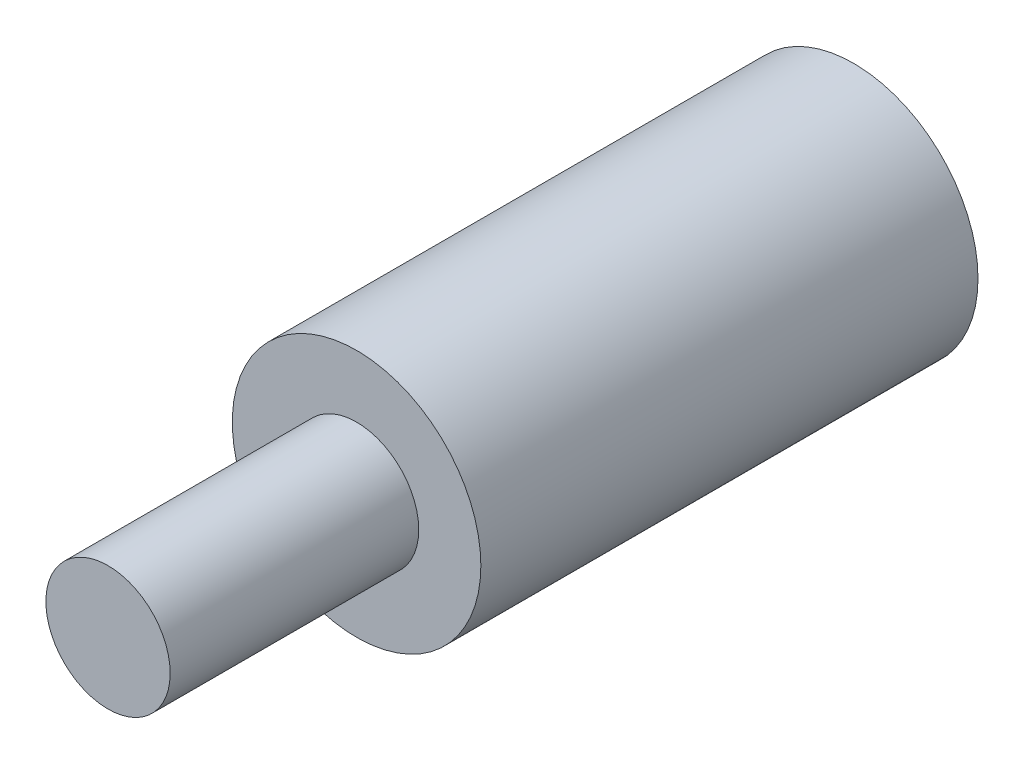
ISO-10303-21;
HEADER;
FILE_DESCRIPTION(('STEP AP214'),'2;1');
FILE_NAME('part.step','',(''),(''),'','','');
FILE_SCHEMA(('AUTOMOTIVE_DESIGN { 1 0 10303 214 1 1 1 1 }'));
ENDSEC;
DATA;
#1=APPLICATION_CONTEXT('core data for automotive mechanical design processes');
#2=APPLICATION_PROTOCOL_DEFINITION('international standard','automotive_design',2000,#1);
#3=PRODUCT_CONTEXT('',#1,'mechanical');
#4=PRODUCT('Part','Part','',(#3));
#5=PRODUCT_RELATED_PRODUCT_CATEGORY('part','',(#4));
#6=PRODUCT_DEFINITION_FORMATION('','',#4);
#7=PRODUCT_DEFINITION_CONTEXT('part definition',#1,'design');
#8=PRODUCT_DEFINITION('design','',#6,#7);
#9=PRODUCT_DEFINITION_SHAPE('','',#8);
#10=(LENGTH_UNIT() NAMED_UNIT(*) SI_UNIT(.MILLI.,.METRE.));
#11=(NAMED_UNIT(*) PLANE_ANGLE_UNIT() SI_UNIT($,.RADIAN.));
#12=(NAMED_UNIT(*) SI_UNIT($,.STERADIAN.) SOLID_ANGLE_UNIT());
#13=UNCERTAINTY_MEASURE_WITH_UNIT(LENGTH_MEASURE(1.E-05),#10,'distance_accuracy_value','');
#14=(GEOMETRIC_REPRESENTATION_CONTEXT(3) GLOBAL_UNCERTAINTY_ASSIGNED_CONTEXT((#13)) GLOBAL_UNIT_ASSIGNED_CONTEXT((#10,
#11,#12)) REPRESENTATION_CONTEXT('',''));
#15=CARTESIAN_POINT('',(0.,0.,0.));
#16=DIRECTION('',(0.,0.,1.));
#17=DIRECTION('',(1.,0.,0.));
#18=AXIS2_PLACEMENT_3D('',#15,#16,#17);
#19=CARTESIAN_POINT('',(0.,0.,20.));
#20=DIRECTION('',(0.,0.,-1.));
#21=DIRECTION('',(-1.,0.,0.));
#22=AXIS2_PLACEMENT_3D('',#19,#20,#21);
#23=CYLINDRICAL_SURFACE('',#22,5.);
#24=CARTESIAN_POINT('',(0.,0.,20.));
#25=DIRECTION('',(0.,0.,1.));
#26=DIRECTION('',(1.,0.,0.));
#27=AXIS2_PLACEMENT_3D('',#24,#25,#26);
#28=CIRCLE('',#27,5.);
#29=CARTESIAN_POINT('',(5.,0.,20.));
#30=VERTEX_POINT('',#29);
#31=EDGE_CURVE('E10',#30,#30,#28,.T.);
#32=ORIENTED_EDGE('',*,*,#31,.F.);
#33=EDGE_LOOP('',(#32));
#34=FACE_BOUND('',#33,.T.);
#35=CARTESIAN_POINT('',(0.,0.,0.));
#36=DIRECTION('',(0.,0.,1.));
#37=DIRECTION('',(1.,0.,0.));
#38=AXIS2_PLACEMENT_3D('',#35,#36,#37);
#39=CIRCLE('',#38,5.);
#40=CARTESIAN_POINT('',(5.,0.,0.));
#41=VERTEX_POINT('',#40);
#42=EDGE_CURVE('E44',#41,#41,#39,.T.);
#43=ORIENTED_EDGE('',*,*,#42,.T.);
#44=EDGE_LOOP('',(#43));
#45=FACE_BOUND('',#44,.T.);
#46=ADVANCED_FACE('F39',(#34,#45),#23,.T.);
#47=CARTESIAN_POINT('',(0.,0.,20.));
#48=DIRECTION('',(0.,0.,1.));
#49=DIRECTION('',(1.,0.,0.));
#50=AXIS2_PLACEMENT_3D('',#47,#48,#49);
#51=PLANE('',#50);
#52=ORIENTED_EDGE('',*,*,#31,.T.);
#53=EDGE_LOOP('',(#52));
#54=FACE_BOUND('',#53,.T.);
#55=ADVANCED_FACE('F71',(#54),#51,.T.);
#56=CARTESIAN_POINT('',(0.,0.,0.));
#57=DIRECTION('',(0.,0.,1.));
#58=DIRECTION('',(1.,0.,0.));
#59=AXIS2_PLACEMENT_3D('',#56,#57,#58);
#60=PLANE('',#59);
#61=CARTESIAN_POINT('',(0.,0.,0.));
#62=DIRECTION('',(0.,0.,1.));
#63=DIRECTION('',(1.,0.,0.));
#64=AXIS2_PLACEMENT_3D('',#61,#62,#63);
#65=CIRCLE('',#64,10.);
#66=CARTESIAN_POINT('',(10.,0.,0.));
#67=VERTEX_POINT('',#66);
#68=EDGE_CURVE('E52',#67,#67,#65,.T.);
#69=ORIENTED_EDGE('',*,*,#68,.T.);
#70=EDGE_LOOP('',(#69));
#71=FACE_BOUND('',#70,.T.);
#72=ORIENTED_EDGE('',*,*,#42,.F.);
#73=EDGE_LOOP('',(#72));
#74=FACE_BOUND('',#73,.T.);
#75=ADVANCED_FACE('F56',(#71,#74),#60,.T.);
#76=CARTESIAN_POINT('',(0.,0.,-40.));
#77=DIRECTION('',(0.,0.,1.));
#78=DIRECTION('',(1.,0.,0.));
#79=AXIS2_PLACEMENT_3D('',#76,#77,#78);
#80=CYLINDRICAL_SURFACE('',#79,10.);
#81=CARTESIAN_POINT('',(0.,0.,-40.));
#82=DIRECTION('',(0.,0.,1.));
#83=DIRECTION('',(1.,0.,0.));
#84=AXIS2_PLACEMENT_3D('',#81,#82,#83);
#85=CIRCLE('',#84,10.);
#86=CARTESIAN_POINT('',(10.,0.,-40.));
#87=VERTEX_POINT('',#86);
#88=EDGE_CURVE('E47',#87,#87,#85,.T.);
#89=ORIENTED_EDGE('',*,*,#88,.T.);
#90=EDGE_LOOP('',(#89));
#91=FACE_BOUND('',#90,.T.);
#92=ORIENTED_EDGE('',*,*,#68,.F.);
#93=EDGE_LOOP('',(#92));
#94=FACE_BOUND('',#93,.T.);
#95=ADVANCED_FACE('F65',(#91,#94),#80,.T.);
#96=CARTESIAN_POINT('',(0.,0.,-40.));
#97=DIRECTION('',(0.,0.,1.));
#98=DIRECTION('',(1.,0.,0.));
#99=AXIS2_PLACEMENT_3D('',#96,#97,#98);
#100=PLANE('',#99);
#101=ORIENTED_EDGE('',*,*,#88,.F.);
#102=EDGE_LOOP('',(#101));
#103=FACE_BOUND('',#102,.T.);
#104=ADVANCED_FACE('F61',(#103),#100,.F.);
#105=CLOSED_SHELL('',(#46,#55,#75,#95,#104));
#106=MANIFOLD_SOLID_BREP('B2',#105);
#107=ADVANCED_BREP_SHAPE_REPRESENTATION('',(#18,#106),#14);
#108=SHAPE_DEFINITION_REPRESENTATION(#9,#107);
ENDSEC;
END-ISO-10303-21;
